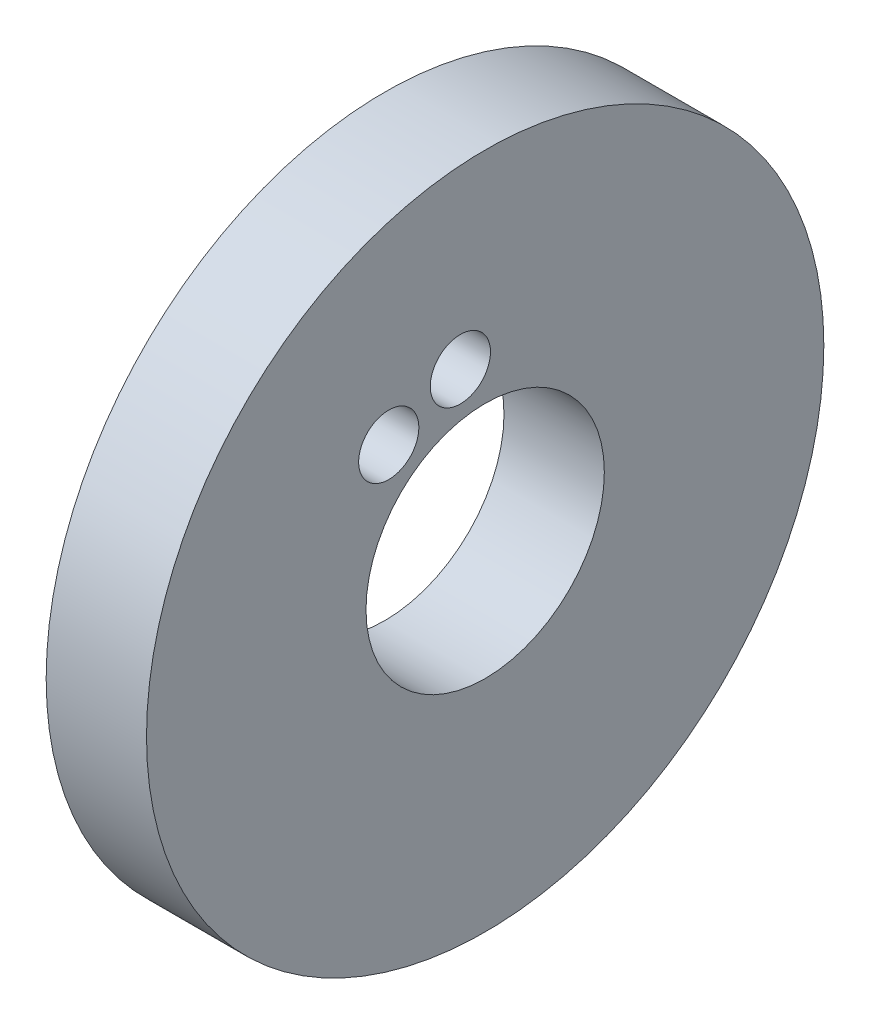
ISO-10303-21;
HEADER;
FILE_DESCRIPTION(('STEP AP214'),'2;1');
FILE_NAME('part.step','',(''),(''),'','','');
FILE_SCHEMA(('AUTOMOTIVE_DESIGN { 1 0 10303 214 1 1 1 1 }'));
ENDSEC;
DATA;
#1=APPLICATION_CONTEXT('core data for automotive mechanical design processes');
#2=APPLICATION_PROTOCOL_DEFINITION('international standard','automotive_design',2000,#1);
#3=PRODUCT_CONTEXT('',#1,'mechanical');
#4=PRODUCT('Part','Part','',(#3));
#5=PRODUCT_RELATED_PRODUCT_CATEGORY('part','',(#4));
#6=PRODUCT_DEFINITION_FORMATION('','',#4);
#7=PRODUCT_DEFINITION_CONTEXT('part definition',#1,'design');
#8=PRODUCT_DEFINITION('design','',#6,#7);
#9=PRODUCT_DEFINITION_SHAPE('','',#8);
#10=(LENGTH_UNIT() NAMED_UNIT(*) SI_UNIT(.MILLI.,.METRE.));
#11=(NAMED_UNIT(*) PLANE_ANGLE_UNIT() SI_UNIT($,.RADIAN.));
#12=(NAMED_UNIT(*) SI_UNIT($,.STERADIAN.) SOLID_ANGLE_UNIT());
#13=UNCERTAINTY_MEASURE_WITH_UNIT(LENGTH_MEASURE(1.E-05),#10,'distance_accuracy_value','');
#14=(GEOMETRIC_REPRESENTATION_CONTEXT(3) GLOBAL_UNCERTAINTY_ASSIGNED_CONTEXT((#13)) GLOBAL_UNIT_ASSIGNED_CONTEXT((#10,
#11,#12)) REPRESENTATION_CONTEXT('',''));
#15=CARTESIAN_POINT('',(0.,0.,0.));
#16=DIRECTION('',(0.,0.,1.));
#17=DIRECTION('',(1.,0.,0.));
#18=AXIS2_PLACEMENT_3D('',#15,#16,#17);
#19=CARTESIAN_POINT('',(135.7,27.,0.));
#20=DIRECTION('',(1.,0.,0.));
#21=DIRECTION('',(0.,0.,-1.));
#22=AXIS2_PLACEMENT_3D('',#19,#20,#21);
#23=PLANE('',#22);
#24=CARTESIAN_POINT('',(135.7,12.8487337040411,1.97738266469541));
#25=DIRECTION('',(1.,0.,0.));
#26=DIRECTION('',(0.,0.,-1.));
#27=AXIS2_PLACEMENT_3D('',#24,#25,#26);
#28=CIRCLE('',#27,2.4);
#29=CARTESIAN_POINT('',(135.7,12.8487337040411,-0.422617335304591));
#30=VERTEX_POINT('',#29);
#31=EDGE_CURVE('E50',#30,#30,#28,.F.);
#32=ORIENTED_EDGE('',*,*,#31,.F.);
#33=EDGE_LOOP('',(#32));
#34=FACE_BOUND('',#33,.T.);
#35=CARTESIAN_POINT('',(135.7,10.4836474229945,7.68720604058077));
#36=DIRECTION('',(1.,0.,0.));
#37=DIRECTION('',(0.,0.,-1.));
#38=AXIS2_PLACEMENT_3D('',#35,#36,#37);
#39=CIRCLE('',#38,2.4);
#40=CARTESIAN_POINT('',(135.7,10.4836474229945,5.28720604058077));
#41=VERTEX_POINT('',#40);
#42=EDGE_CURVE('E53',#41,#41,#39,.F.);
#43=ORIENTED_EDGE('',*,*,#42,.F.);
#44=EDGE_LOOP('',(#43));
#45=FACE_BOUND('',#44,.T.);
#46=CARTESIAN_POINT('',(135.7,0.,0.));
#47=DIRECTION('',(-1.,0.,0.));
#48=DIRECTION('',(0.,0.,1.));
#49=AXIS2_PLACEMENT_3D('',#46,#47,#48);
#50=CIRCLE('',#49,9.5);
#51=CARTESIAN_POINT('',(135.7,0.,9.5));
#52=VERTEX_POINT('',#51);
#53=EDGE_CURVE('E10',#52,#52,#50,.T.);
#54=ORIENTED_EDGE('',*,*,#53,.F.);
#55=EDGE_LOOP('',(#54));
#56=FACE_BOUND('',#55,.T.);
#57=CARTESIAN_POINT('',(135.7,0.,0.));
#58=DIRECTION('',(-1.,0.,0.));
#59=DIRECTION('',(0.,0.,1.));
#60=AXIS2_PLACEMENT_3D('',#57,#58,#59);
#61=CIRCLE('',#60,27.);
#62=CARTESIAN_POINT('',(135.7,0.,27.));
#63=VERTEX_POINT('',#62);
#64=EDGE_CURVE('E45',#63,#63,#61,.T.);
#65=ORIENTED_EDGE('',*,*,#64,.T.);
#66=EDGE_LOOP('',(#65));
#67=FACE_BOUND('',#66,.T.);
#68=ADVANCED_FACE('F31',(#34,#45,#56,#67),#23,.F.);
#69=CARTESIAN_POINT('',(-110.,0.,0.));
#70=DIRECTION('',(-1.,0.,0.));
#71=DIRECTION('',(0.,0.,1.));
#72=AXIS2_PLACEMENT_3D('',#69,#70,#71);
#73=CYLINDRICAL_SURFACE('',#72,9.5);
#74=CARTESIAN_POINT('',(143.7,0.,0.));
#75=DIRECTION('',(-1.,0.,0.));
#76=DIRECTION('',(0.,0.,1.));
#77=AXIS2_PLACEMENT_3D('',#74,#75,#76);
#78=CIRCLE('',#77,9.5);
#79=CARTESIAN_POINT('',(143.7,0.,9.5));
#80=VERTEX_POINT('',#79);
#81=EDGE_CURVE('E37',#80,#80,#78,.T.);
#82=ORIENTED_EDGE('',*,*,#81,.F.);
#83=EDGE_LOOP('',(#82));
#84=FACE_BOUND('',#83,.T.);
#85=ORIENTED_EDGE('',*,*,#53,.T.);
#86=EDGE_LOOP('',(#85));
#87=FACE_BOUND('',#86,.T.);
#88=ADVANCED_FACE('F70',(#84,#87),#73,.F.);
#89=CARTESIAN_POINT('',(143.7,9.5,0.));
#90=DIRECTION('',(-1.,0.,0.));
#91=DIRECTION('',(0.,0.,1.));
#92=AXIS2_PLACEMENT_3D('',#89,#90,#91);
#93=PLANE('',#92);
#94=CARTESIAN_POINT('',(143.7,12.8487337040411,1.97738266469541));
#95=DIRECTION('',(1.,0.,0.));
#96=DIRECTION('',(0.,0.,-1.));
#97=AXIS2_PLACEMENT_3D('',#94,#95,#96);
#98=CIRCLE('',#97,2.4);
#99=CARTESIAN_POINT('',(143.7,12.8487337040411,-0.422617335304591));
#100=VERTEX_POINT('',#99);
#101=EDGE_CURVE('E56',#100,#100,#98,.T.);
#102=ORIENTED_EDGE('',*,*,#101,.F.);
#103=EDGE_LOOP('',(#102));
#104=FACE_BOUND('',#103,.T.);
#105=CARTESIAN_POINT('',(143.7,10.4836474229945,7.68720604058077));
#106=DIRECTION('',(1.,0.,0.));
#107=DIRECTION('',(0.,0.,-1.));
#108=AXIS2_PLACEMENT_3D('',#105,#106,#107);
#109=CIRCLE('',#108,2.4);
#110=CARTESIAN_POINT('',(143.7,10.4836474229945,5.28720604058077));
#111=VERTEX_POINT('',#110);
#112=EDGE_CURVE('E57',#111,#111,#109,.T.);
#113=ORIENTED_EDGE('',*,*,#112,.F.);
#114=EDGE_LOOP('',(#113));
#115=FACE_BOUND('',#114,.T.);
#116=CARTESIAN_POINT('',(143.7,0.,0.));
#117=DIRECTION('',(-1.,0.,0.));
#118=DIRECTION('',(0.,0.,1.));
#119=AXIS2_PLACEMENT_3D('',#116,#117,#118);
#120=CIRCLE('',#119,27.);
#121=CARTESIAN_POINT('',(143.7,0.,27.));
#122=VERTEX_POINT('',#121);
#123=EDGE_CURVE('E41',#122,#122,#120,.T.);
#124=ORIENTED_EDGE('',*,*,#123,.F.);
#125=EDGE_LOOP('',(#124));
#126=FACE_BOUND('',#125,.T.);
#127=ORIENTED_EDGE('',*,*,#81,.T.);
#128=EDGE_LOOP('',(#127));
#129=FACE_BOUND('',#128,.T.);
#130=ADVANCED_FACE('F66',(#104,#115,#126,#129),#93,.F.);
#131=CARTESIAN_POINT('',(-110.,0.,0.));
#132=DIRECTION('',(-1.,0.,0.));
#133=DIRECTION('',(0.,0.,1.));
#134=AXIS2_PLACEMENT_3D('',#131,#132,#133);
#135=CYLINDRICAL_SURFACE('',#134,27.);
#136=ORIENTED_EDGE('',*,*,#64,.F.);
#137=EDGE_LOOP('',(#136));
#138=FACE_BOUND('',#137,.T.);
#139=ORIENTED_EDGE('',*,*,#123,.T.);
#140=EDGE_LOOP('',(#139));
#141=FACE_BOUND('',#140,.T.);
#142=ADVANCED_FACE('F69',(#138,#141),#135,.T.);
#143=CARTESIAN_POINT('',(135.7,10.4836474229945,7.68720604058077));
#144=DIRECTION('',(-1.,0.,0.));
#145=DIRECTION('',(0.,0.,1.));
#146=AXIS2_PLACEMENT_3D('',#143,#144,#145);
#147=CYLINDRICAL_SURFACE('',#146,2.4);
#148=ORIENTED_EDGE('',*,*,#112,.T.);
#149=EDGE_LOOP('',(#148));
#150=FACE_BOUND('',#149,.T.);
#151=ORIENTED_EDGE('',*,*,#42,.T.);
#152=EDGE_LOOP('',(#151));
#153=FACE_BOUND('',#152,.T.);
#154=ADVANCED_FACE('F77',(#150,#153),#147,.F.);
#155=CARTESIAN_POINT('',(135.7,12.8487337040411,1.97738266469541));
#156=DIRECTION('',(-1.,0.,0.));
#157=DIRECTION('',(0.,0.,1.));
#158=AXIS2_PLACEMENT_3D('',#155,#156,#157);
#159=CYLINDRICAL_SURFACE('',#158,2.4);
#160=ORIENTED_EDGE('',*,*,#101,.T.);
#161=EDGE_LOOP('',(#160));
#162=FACE_BOUND('',#161,.T.);
#163=ORIENTED_EDGE('',*,*,#31,.T.);
#164=EDGE_LOOP('',(#163));
#165=FACE_BOUND('',#164,.T.);
#166=ADVANCED_FACE('F63',(#162,#165),#159,.F.);
#167=CLOSED_SHELL('',(#68,#88,#130,#142,#154,#166));
#168=MANIFOLD_SOLID_BREP('B2',#167);
#169=ADVANCED_BREP_SHAPE_REPRESENTATION('',(#18,#168),#14);
#170=SHAPE_DEFINITION_REPRESENTATION(#9,#169);
ENDSEC;
END-ISO-10303-21;
